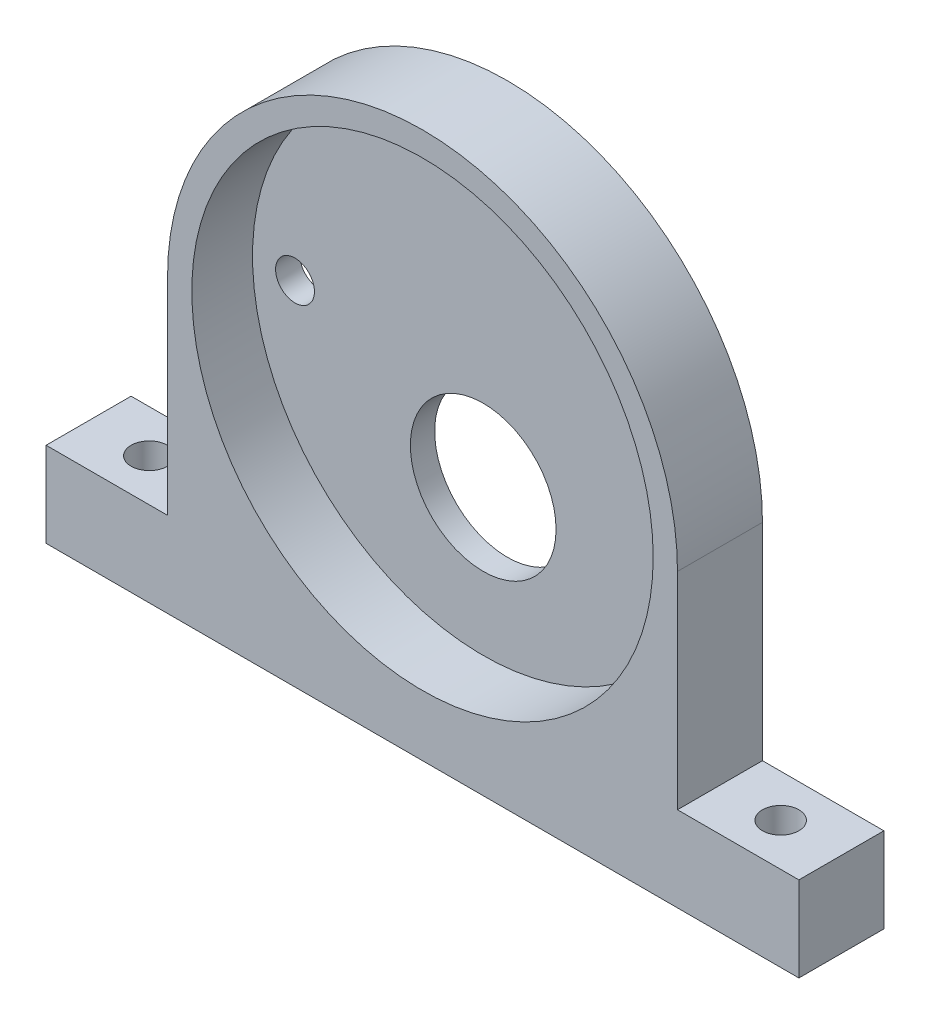
ISO-10303-21;
HEADER;
FILE_DESCRIPTION(('STEP AP214'),'2;1');
FILE_NAME('part.step','',(''),(''),'','','');
FILE_SCHEMA(('AUTOMOTIVE_DESIGN { 1 0 10303 214 1 1 1 1 }'));
ENDSEC;
DATA;
#1=APPLICATION_CONTEXT('core data for automotive mechanical design processes');
#2=APPLICATION_PROTOCOL_DEFINITION('international standard','automotive_design',2000,#1);
#3=PRODUCT_CONTEXT('',#1,'mechanical');
#4=PRODUCT('Part','Part','',(#3));
#5=PRODUCT_RELATED_PRODUCT_CATEGORY('part','',(#4));
#6=PRODUCT_DEFINITION_FORMATION('','',#4);
#7=PRODUCT_DEFINITION_CONTEXT('part definition',#1,'design');
#8=PRODUCT_DEFINITION('design','',#6,#7);
#9=PRODUCT_DEFINITION_SHAPE('','',#8);
#10=(LENGTH_UNIT() NAMED_UNIT(*) SI_UNIT(.MILLI.,.METRE.));
#11=(NAMED_UNIT(*) PLANE_ANGLE_UNIT() SI_UNIT($,.RADIAN.));
#12=(NAMED_UNIT(*) SI_UNIT($,.STERADIAN.) SOLID_ANGLE_UNIT());
#13=UNCERTAINTY_MEASURE_WITH_UNIT(LENGTH_MEASURE(1.E-05),#10,'distance_accuracy_value','');
#14=(GEOMETRIC_REPRESENTATION_CONTEXT(3) GLOBAL_UNCERTAINTY_ASSIGNED_CONTEXT((#13)) GLOBAL_UNIT_ASSIGNED_CONTEXT((#10,
#11,#12)) REPRESENTATION_CONTEXT('',''));
#15=CARTESIAN_POINT('',(0.,0.,0.));
#16=DIRECTION('',(0.,0.,1.));
#17=DIRECTION('',(1.,0.,0.));
#18=AXIS2_PLACEMENT_3D('',#15,#16,#17);
#19=CARTESIAN_POINT('',(0.,3.5,7.));
#20=DIRECTION('',(0.,1.,0.));
#21=DIRECTION('',(0.,0.,1.));
#22=AXIS2_PLACEMENT_3D('',#19,#20,#21);
#23=PLANE('',#22);
#24=CARTESIAN_POINT('',(26.,3.5,3.50000000000008));
#25=DIRECTION('',(0.,1.,0.));
#26=DIRECTION('',(0.,0.,-1.));
#27=AXIS2_PLACEMENT_3D('',#24,#25,#26);
#28=CIRCLE('',#27,1.5);
#29=CARTESIAN_POINT('',(26.,3.5,2.00000000000008));
#30=VERTEX_POINT('',#29);
#31=EDGE_CURVE('E215',#30,#30,#28,.T.);
#32=ORIENTED_EDGE('',*,*,#31,.F.);
#33=EDGE_LOOP('',(#32));
#34=FACE_BOUND('',#33,.T.);
#35=DIRECTION('',(1.,0.,0.));
#36=VECTOR('',#35,1.);
#37=CARTESIAN_POINT('',(0.,3.5,0.));
#38=LINE('',#37,#36);
#39=CARTESIAN_POINT('',(21.,3.5,0.));
#40=VERTEX_POINT('',#39);
#41=CARTESIAN_POINT('',(31.,3.5,0.));
#42=VERTEX_POINT('',#41);
#43=EDGE_CURVE('E145',#40,#42,#38,.T.);
#44=ORIENTED_EDGE('',*,*,#43,.F.);
#45=DIRECTION('',(0.,0.,-1.));
#46=VECTOR('',#45,1.);
#47=CARTESIAN_POINT('',(21.,3.5,7.));
#48=LINE('',#47,#46);
#49=CARTESIAN_POINT('',(21.,3.5,7.));
#50=VERTEX_POINT('',#49);
#51=EDGE_CURVE('E11',#50,#40,#48,.T.);
#52=ORIENTED_EDGE('',*,*,#51,.F.);
#53=DIRECTION('',(1.,0.,0.));
#54=VECTOR('',#53,1.);
#55=CARTESIAN_POINT('',(0.,3.5,7.));
#56=LINE('',#55,#54);
#57=CARTESIAN_POINT('',(31.,3.5,7.));
#58=VERTEX_POINT('',#57);
#59=EDGE_CURVE('E140',#50,#58,#56,.T.);
#60=ORIENTED_EDGE('',*,*,#59,.T.);
#61=DIRECTION('',(0.,0.,-1.));
#62=VECTOR('',#61,1.);
#63=CARTESIAN_POINT('',(31.,3.5,7.));
#64=LINE('',#63,#62);
#65=EDGE_CURVE('E98',#58,#42,#64,.T.);
#66=ORIENTED_EDGE('',*,*,#65,.T.);
#67=EDGE_LOOP('',(#44,#52,#60,#66));
#68=FACE_BOUND('',#67,.T.);
#69=ADVANCED_FACE('F46',(#34,#68),#23,.T.);
#70=CARTESIAN_POINT('',(21.,0.,7.));
#71=DIRECTION('',(1.,0.,0.));
#72=DIRECTION('',(0.,0.,-1.));
#73=AXIS2_PLACEMENT_3D('',#70,#71,#72);
#74=PLANE('',#73);
#75=DIRECTION('',(0.,-1.,0.));
#76=VECTOR('',#75,1.);
#77=CARTESIAN_POINT('',(21.,0.,0.));
#78=LINE('',#77,#76);
#79=CARTESIAN_POINT('',(21.,20.5,0.));
#80=VERTEX_POINT('',#79);
#81=EDGE_CURVE('E148',#80,#40,#78,.T.);
#82=ORIENTED_EDGE('',*,*,#81,.F.);
#83=DIRECTION('',(0.,0.,-1.));
#84=VECTOR('',#83,1.);
#85=CARTESIAN_POINT('',(21.,20.5,7.));
#86=LINE('',#85,#84);
#87=CARTESIAN_POINT('',(21.,20.5,7.));
#88=VERTEX_POINT('',#87);
#89=EDGE_CURVE('E55',#88,#80,#86,.T.);
#90=ORIENTED_EDGE('',*,*,#89,.F.);
#91=DIRECTION('',(0.,-1.,0.));
#92=VECTOR('',#91,1.);
#93=CARTESIAN_POINT('',(21.,0.,7.));
#94=LINE('',#93,#92);
#95=EDGE_CURVE('E183',#88,#50,#94,.T.);
#96=ORIENTED_EDGE('',*,*,#95,.T.);
#97=ORIENTED_EDGE('',*,*,#51,.T.);
#98=EDGE_LOOP('',(#82,#90,#96,#97));
#99=FACE_BOUND('',#98,.T.);
#100=ADVANCED_FACE('F48',(#99),#74,.T.);
#101=CARTESIAN_POINT('',(0.,20.5,7.));
#102=DIRECTION('',(0.,0.,-1.));
#103=DIRECTION('',(-1.,0.,0.));
#104=AXIS2_PLACEMENT_3D('',#101,#102,#103);
#105=CYLINDRICAL_SURFACE('',#104,21.);
#106=CARTESIAN_POINT('',(0.,20.5,0.));
#107=DIRECTION('',(0.,0.,1.));
#108=DIRECTION('',(1.,0.,0.));
#109=AXIS2_PLACEMENT_3D('',#106,#107,#108);
#110=CIRCLE('',#109,21.);
#111=CARTESIAN_POINT('',(-21.,20.5,0.));
#112=VERTEX_POINT('',#111);
#113=EDGE_CURVE('E153',#80,#112,#110,.T.);
#114=ORIENTED_EDGE('',*,*,#113,.T.);
#115=DIRECTION('',(0.,0.,-1.));
#116=VECTOR('',#115,1.);
#117=CARTESIAN_POINT('',(-21.,20.5,7.));
#118=LINE('',#117,#116);
#119=CARTESIAN_POINT('',(-21.,20.5,7.));
#120=VERTEX_POINT('',#119);
#121=EDGE_CURVE('E167',#120,#112,#118,.T.);
#122=ORIENTED_EDGE('',*,*,#121,.F.);
#123=CARTESIAN_POINT('',(0.,20.5,7.));
#124=DIRECTION('',(0.,0.,1.));
#125=DIRECTION('',(1.,0.,0.));
#126=AXIS2_PLACEMENT_3D('',#123,#124,#125);
#127=CIRCLE('',#126,21.);
#128=EDGE_CURVE('E174',#88,#120,#127,.T.);
#129=ORIENTED_EDGE('',*,*,#128,.F.);
#130=ORIENTED_EDGE('',*,*,#89,.T.);
#131=EDGE_LOOP('',(#114,#122,#129,#130));
#132=FACE_BOUND('',#131,.T.);
#133=ADVANCED_FACE('F172',(#132),#105,.T.);
#134=CARTESIAN_POINT('',(-21.,0.,7.));
#135=DIRECTION('',(1.,0.,0.));
#136=DIRECTION('',(0.,0.,-1.));
#137=AXIS2_PLACEMENT_3D('',#134,#135,#136);
#138=PLANE('',#137);
#139=DIRECTION('',(0.,-1.,0.));
#140=VECTOR('',#139,1.);
#141=CARTESIAN_POINT('',(-21.,0.,0.));
#142=LINE('',#141,#140);
#143=CARTESIAN_POINT('',(-21.,3.5,0.));
#144=VERTEX_POINT('',#143);
#145=EDGE_CURVE('E155',#112,#144,#142,.T.);
#146=ORIENTED_EDGE('',*,*,#145,.T.);
#147=DIRECTION('',(0.,0.,-1.));
#148=VECTOR('',#147,1.);
#149=CARTESIAN_POINT('',(-21.,3.5,7.));
#150=LINE('',#149,#148);
#151=CARTESIAN_POINT('',(-21.,3.5,7.));
#152=VERTEX_POINT('',#151);
#153=EDGE_CURVE('E165',#152,#144,#150,.T.);
#154=ORIENTED_EDGE('',*,*,#153,.F.);
#155=DIRECTION('',(0.,-1.,0.));
#156=VECTOR('',#155,1.);
#157=CARTESIAN_POINT('',(-21.,0.,7.));
#158=LINE('',#157,#156);
#159=EDGE_CURVE('E138',#120,#152,#158,.T.);
#160=ORIENTED_EDGE('',*,*,#159,.F.);
#161=ORIENTED_EDGE('',*,*,#121,.T.);
#162=EDGE_LOOP('',(#146,#154,#160,#161));
#163=FACE_BOUND('',#162,.T.);
#164=ADVANCED_FACE('F194',(#163),#138,.F.);
#165=CARTESIAN_POINT('',(-26.,3.5,3.5));
#166=DIRECTION('',(0.,1.,0.));
#167=DIRECTION('',(0.,0.,1.));
#168=AXIS2_PLACEMENT_3D('',#165,#166,#167);
#169=CIRCLE('',#168,1.5);
#170=CARTESIAN_POINT('',(-26.,3.5,5.));
#171=VERTEX_POINT('',#170);
#172=EDGE_CURVE('E217',#171,#171,#169,.T.);
#173=ORIENTED_EDGE('',*,*,#172,.F.);
#174=EDGE_LOOP('',(#173));
#175=FACE_BOUND('',#174,.T.);
#176=CARTESIAN_POINT('',(-31.,3.5,0.));
#177=VERTEX_POINT('',#176);
#178=EDGE_CURVE('E150',#177,#144,#38,.T.);
#179=ORIENTED_EDGE('',*,*,#178,.F.);
#180=DIRECTION('',(0.,0.,-1.));
#181=VECTOR('',#180,1.);
#182=CARTESIAN_POINT('',(-31.,3.5,7.));
#183=LINE('',#182,#181);
#184=CARTESIAN_POINT('',(-31.,3.5,7.));
#185=VERTEX_POINT('',#184);
#186=EDGE_CURVE('E127',#185,#177,#183,.T.);
#187=ORIENTED_EDGE('',*,*,#186,.F.);
#188=EDGE_CURVE('E136',#185,#152,#56,.T.);
#189=ORIENTED_EDGE('',*,*,#188,.T.);
#190=ORIENTED_EDGE('',*,*,#153,.T.);
#191=EDGE_LOOP('',(#179,#187,#189,#190));
#192=FACE_BOUND('',#191,.T.);
#193=ADVANCED_FACE('F197',(#175,#192),#23,.T.);
#194=CARTESIAN_POINT('',(-31.,0.,7.));
#195=DIRECTION('',(-1.,0.,0.));
#196=DIRECTION('',(0.,0.,1.));
#197=AXIS2_PLACEMENT_3D('',#194,#195,#196);
#198=PLANE('',#197);
#199=DIRECTION('',(0.,1.,0.));
#200=VECTOR('',#199,1.);
#201=CARTESIAN_POINT('',(-31.,0.,0.));
#202=LINE('',#201,#200);
#203=CARTESIAN_POINT('',(-31.,-3.5,0.));
#204=VERTEX_POINT('',#203);
#205=EDGE_CURVE('E126',#204,#177,#202,.T.);
#206=ORIENTED_EDGE('',*,*,#205,.F.);
#207=DIRECTION('',(0.,0.,-1.));
#208=VECTOR('',#207,1.);
#209=CARTESIAN_POINT('',(-31.,-3.5,7.));
#210=LINE('',#209,#208);
#211=CARTESIAN_POINT('',(-31.,-3.5,7.));
#212=VERTEX_POINT('',#211);
#213=EDGE_CURVE('E120',#212,#204,#210,.T.);
#214=ORIENTED_EDGE('',*,*,#213,.F.);
#215=DIRECTION('',(0.,1.,0.));
#216=VECTOR('',#215,1.);
#217=CARTESIAN_POINT('',(-31.,0.,7.));
#218=LINE('',#217,#216);
#219=EDGE_CURVE('E124',#212,#185,#218,.T.);
#220=ORIENTED_EDGE('',*,*,#219,.T.);
#221=ORIENTED_EDGE('',*,*,#186,.T.);
#222=EDGE_LOOP('',(#206,#214,#220,#221));
#223=FACE_BOUND('',#222,.T.);
#224=ADVANCED_FACE('F122',(#223),#198,.T.);
#225=CARTESIAN_POINT('',(0.,-3.5,7.));
#226=DIRECTION('',(0.,1.,0.));
#227=DIRECTION('',(0.,0.,1.));
#228=AXIS2_PLACEMENT_3D('',#225,#226,#227);
#229=PLANE('',#228);
#230=CARTESIAN_POINT('',(-26.,-3.5,3.5));
#231=DIRECTION('',(0.,1.,0.));
#232=DIRECTION('',(0.,0.,1.));
#233=AXIS2_PLACEMENT_3D('',#230,#231,#232);
#234=CIRCLE('',#233,1.5);
#235=CARTESIAN_POINT('',(-26.,-3.5,5.));
#236=VERTEX_POINT('',#235);
#237=EDGE_CURVE('E221',#236,#236,#234,.F.);
#238=ORIENTED_EDGE('',*,*,#237,.F.);
#239=EDGE_LOOP('',(#238));
#240=FACE_BOUND('',#239,.T.);
#241=CARTESIAN_POINT('',(26.,-3.5,3.50000000000008));
#242=DIRECTION('',(0.,1.,0.));
#243=DIRECTION('',(0.,0.,1.));
#244=AXIS2_PLACEMENT_3D('',#241,#242,#243);
#245=CIRCLE('',#244,1.5);
#246=CARTESIAN_POINT('',(26.,-3.5,5.00000000000007));
#247=VERTEX_POINT('',#246);
#248=EDGE_CURVE('E218',#247,#247,#245,.F.);
#249=ORIENTED_EDGE('',*,*,#248,.F.);
#250=EDGE_LOOP('',(#249));
#251=FACE_BOUND('',#250,.T.);
#252=CARTESIAN_POINT('',(-14.,-3.5,3.49999999999996));
#253=DIRECTION('',(0.,-1.,0.));
#254=DIRECTION('',(0.,0.,-1.));
#255=AXIS2_PLACEMENT_3D('',#252,#253,#254);
#256=CIRCLE('',#255,1.25);
#257=CARTESIAN_POINT('',(-14.,-3.5,2.24999999999996));
#258=VERTEX_POINT('',#257);
#259=EDGE_CURVE('E227',#258,#258,#256,.T.);
#260=ORIENTED_EDGE('',*,*,#259,.F.);
#261=EDGE_LOOP('',(#260));
#262=FACE_BOUND('',#261,.T.);
#263=CARTESIAN_POINT('',(14.,-3.5,3.5));
#264=DIRECTION('',(0.,-1.,0.));
#265=DIRECTION('',(0.,0.,-1.));
#266=AXIS2_PLACEMENT_3D('',#263,#264,#265);
#267=CIRCLE('',#266,1.25);
#268=CARTESIAN_POINT('',(14.,-3.5,2.25));
#269=VERTEX_POINT('',#268);
#270=EDGE_CURVE('E233',#269,#269,#267,.T.);
#271=ORIENTED_EDGE('',*,*,#270,.F.);
#272=EDGE_LOOP('',(#271));
#273=FACE_BOUND('',#272,.T.);
#274=DIRECTION('',(1.,0.,0.));
#275=VECTOR('',#274,1.);
#276=CARTESIAN_POINT('',(0.,-3.5,0.));
#277=LINE('',#276,#275);
#278=CARTESIAN_POINT('',(31.,-3.5,0.));
#279=VERTEX_POINT('',#278);
#280=EDGE_CURVE('E91',#204,#279,#277,.T.);
#281=ORIENTED_EDGE('',*,*,#280,.T.);
#282=DIRECTION('',(0.,0.,-1.));
#283=VECTOR('',#282,1.);
#284=CARTESIAN_POINT('',(31.,-3.5,7.));
#285=LINE('',#284,#283);
#286=CARTESIAN_POINT('',(31.,-3.5,7.));
#287=VERTEX_POINT('',#286);
#288=EDGE_CURVE('E128',#287,#279,#285,.T.);
#289=ORIENTED_EDGE('',*,*,#288,.F.);
#290=DIRECTION('',(1.,0.,0.));
#291=VECTOR('',#290,1.);
#292=CARTESIAN_POINT('',(0.,-3.5,7.));
#293=LINE('',#292,#291);
#294=EDGE_CURVE('E130',#212,#287,#293,.T.);
#295=ORIENTED_EDGE('',*,*,#294,.F.);
#296=ORIENTED_EDGE('',*,*,#213,.T.);
#297=EDGE_LOOP('',(#281,#289,#295,#296));
#298=FACE_BOUND('',#297,.T.);
#299=ADVANCED_FACE('F131',(#240,#251,#262,#273,#298),#229,.F.);
#300=CARTESIAN_POINT('',(31.,0.,7.));
#301=DIRECTION('',(-1.,0.,0.));
#302=DIRECTION('',(0.,-1.,0.));
#303=AXIS2_PLACEMENT_3D('',#300,#301,#302);
#304=PLANE('',#303);
#305=DIRECTION('',(0.,1.,0.));
#306=VECTOR('',#305,1.);
#307=CARTESIAN_POINT('',(31.,0.,0.));
#308=LINE('',#307,#306);
#309=EDGE_CURVE('E160',#279,#42,#308,.T.);
#310=ORIENTED_EDGE('',*,*,#309,.T.);
#311=ORIENTED_EDGE('',*,*,#65,.F.);
#312=DIRECTION('',(0.,1.,0.));
#313=VECTOR('',#312,1.);
#314=CARTESIAN_POINT('',(31.,0.,7.));
#315=LINE('',#314,#313);
#316=EDGE_CURVE('E63',#287,#58,#315,.T.);
#317=ORIENTED_EDGE('',*,*,#316,.F.);
#318=ORIENTED_EDGE('',*,*,#288,.T.);
#319=EDGE_LOOP('',(#310,#311,#317,#318));
#320=FACE_BOUND('',#319,.T.);
#321=ADVANCED_FACE('F186',(#320),#304,.F.);
#322=CARTESIAN_POINT('',(0.,0.,7.));
#323=DIRECTION('',(0.,0.,1.));
#324=DIRECTION('',(1.,0.,0.));
#325=AXIS2_PLACEMENT_3D('',#322,#323,#324);
#326=PLANE('',#325);
#327=CARTESIAN_POINT('',(0.,20.5,7.));
#328=DIRECTION('',(0.,0.,1.));
#329=DIRECTION('',(1.,0.,0.));
#330=AXIS2_PLACEMENT_3D('',#327,#328,#329);
#331=CIRCLE('',#330,19.);
#332=CARTESIAN_POINT('',(19.,20.5,7.));
#333=VERTEX_POINT('',#332);
#334=EDGE_CURVE('E189',#333,#333,#331,.T.);
#335=ORIENTED_EDGE('',*,*,#334,.F.);
#336=EDGE_LOOP('',(#335));
#337=FACE_BOUND('',#336,.T.);
#338=ORIENTED_EDGE('',*,*,#59,.F.);
#339=ORIENTED_EDGE('',*,*,#95,.F.);
#340=ORIENTED_EDGE('',*,*,#128,.T.);
#341=ORIENTED_EDGE('',*,*,#159,.T.);
#342=ORIENTED_EDGE('',*,*,#188,.F.);
#343=ORIENTED_EDGE('',*,*,#219,.F.);
#344=ORIENTED_EDGE('',*,*,#294,.T.);
#345=ORIENTED_EDGE('',*,*,#316,.T.);
#346=EDGE_LOOP('',(#338,#339,#340,#341,#342,#343,#344,#345));
#347=FACE_BOUND('',#346,.T.);
#348=ADVANCED_FACE('F134',(#337,#347),#326,.T.);
#349=CARTESIAN_POINT('',(0.,0.,0.));
#350=DIRECTION('',(0.,0.,1.));
#351=DIRECTION('',(1.,0.,0.));
#352=AXIS2_PLACEMENT_3D('',#349,#350,#351);
#353=PLANE('',#352);
#354=CARTESIAN_POINT('',(-15.5,20.5,0.));
#355=DIRECTION('',(0.,0.,1.));
#356=DIRECTION('',(1.,0.,0.));
#357=AXIS2_PLACEMENT_3D('',#354,#355,#356);
#358=CIRCLE('',#357,1.6);
#359=CARTESIAN_POINT('',(-13.9,20.5,0.));
#360=VERTEX_POINT('',#359);
#361=EDGE_CURVE('E254',#360,#360,#358,.T.);
#362=ORIENTED_EDGE('',*,*,#361,.T.);
#363=EDGE_LOOP('',(#362));
#364=FACE_BOUND('',#363,.T.);
#365=CARTESIAN_POINT('',(15.5,20.5,0.));
#366=DIRECTION('',(0.,0.,1.));
#367=DIRECTION('',(1.,0.,0.));
#368=AXIS2_PLACEMENT_3D('',#365,#366,#367);
#369=CIRCLE('',#368,1.6);
#370=CARTESIAN_POINT('',(17.1,20.5,0.));
#371=VERTEX_POINT('',#370);
#372=EDGE_CURVE('E251',#371,#371,#369,.T.);
#373=ORIENTED_EDGE('',*,*,#372,.T.);
#374=EDGE_LOOP('',(#373));
#375=FACE_BOUND('',#374,.T.);
#376=CARTESIAN_POINT('',(0.,13.5,0.));
#377=DIRECTION('',(0.,0.,1.));
#378=DIRECTION('',(1.,0.,0.));
#379=AXIS2_PLACEMENT_3D('',#376,#377,#378);
#380=CIRCLE('',#379,6.);
#381=CARTESIAN_POINT('',(6.,13.5,0.));
#382=VERTEX_POINT('',#381);
#383=EDGE_CURVE('E248',#382,#382,#380,.T.);
#384=ORIENTED_EDGE('',*,*,#383,.T.);
#385=EDGE_LOOP('',(#384));
#386=FACE_BOUND('',#385,.T.);
#387=ORIENTED_EDGE('',*,*,#43,.T.);
#388=ORIENTED_EDGE('',*,*,#309,.F.);
#389=ORIENTED_EDGE('',*,*,#280,.F.);
#390=ORIENTED_EDGE('',*,*,#205,.T.);
#391=ORIENTED_EDGE('',*,*,#178,.T.);
#392=ORIENTED_EDGE('',*,*,#145,.F.);
#393=ORIENTED_EDGE('',*,*,#113,.F.);
#394=ORIENTED_EDGE('',*,*,#81,.T.);
#395=EDGE_LOOP('',(#387,#388,#389,#390,#391,#392,#393,#394));
#396=FACE_BOUND('',#395,.T.);
#397=ADVANCED_FACE('F181',(#364,#375,#386,#396),#353,.F.);
#398=CARTESIAN_POINT('',(0.,20.5,2.));
#399=DIRECTION('',(0.,0.,1.));
#400=DIRECTION('',(1.,0.,0.));
#401=AXIS2_PLACEMENT_3D('',#398,#399,#400);
#402=CYLINDRICAL_SURFACE('',#401,19.);
#403=CARTESIAN_POINT('',(0.,20.5,2.));
#404=DIRECTION('',(0.,0.,1.));
#405=DIRECTION('',(1.,0.,0.));
#406=AXIS2_PLACEMENT_3D('',#403,#404,#405);
#407=CIRCLE('',#406,19.);
#408=CARTESIAN_POINT('',(19.,20.5,2.));
#409=VERTEX_POINT('',#408);
#410=EDGE_CURVE('E149',#409,#409,#407,.T.);
#411=ORIENTED_EDGE('',*,*,#410,.F.);
#412=EDGE_LOOP('',(#411));
#413=FACE_BOUND('',#412,.T.);
#414=ORIENTED_EDGE('',*,*,#334,.T.);
#415=EDGE_LOOP('',(#414));
#416=FACE_BOUND('',#415,.T.);
#417=ADVANCED_FACE('F262',(#413,#416),#402,.F.);
#418=CARTESIAN_POINT('',(0.,20.5,2.));
#419=DIRECTION('',(0.,0.,1.));
#420=DIRECTION('',(1.,0.,0.));
#421=AXIS2_PLACEMENT_3D('',#418,#419,#420);
#422=PLANE('',#421);
#423=CARTESIAN_POINT('',(-15.5,20.5,2.));
#424=DIRECTION('',(0.,0.,1.));
#425=DIRECTION('',(-1.,0.,0.));
#426=AXIS2_PLACEMENT_3D('',#423,#424,#425);
#427=CIRCLE('',#426,1.6);
#428=CARTESIAN_POINT('',(-17.1,20.5,2.));
#429=VERTEX_POINT('',#428);
#430=EDGE_CURVE('E239',#429,#429,#427,.T.);
#431=ORIENTED_EDGE('',*,*,#430,.F.);
#432=EDGE_LOOP('',(#431));
#433=FACE_BOUND('',#432,.T.);
#434=CARTESIAN_POINT('',(15.5,20.5,2.));
#435=DIRECTION('',(0.,0.,1.));
#436=DIRECTION('',(1.,0.,0.));
#437=AXIS2_PLACEMENT_3D('',#434,#435,#436);
#438=CIRCLE('',#437,1.6);
#439=CARTESIAN_POINT('',(17.1,20.5,2.));
#440=VERTEX_POINT('',#439);
#441=EDGE_CURVE('E240',#440,#440,#438,.T.);
#442=ORIENTED_EDGE('',*,*,#441,.F.);
#443=EDGE_LOOP('',(#442));
#444=FACE_BOUND('',#443,.T.);
#445=CARTESIAN_POINT('',(0.,13.5,2.));
#446=DIRECTION('',(0.,0.,1.));
#447=DIRECTION('',(1.,0.,0.));
#448=AXIS2_PLACEMENT_3D('',#445,#446,#447);
#449=CIRCLE('',#448,6.);
#450=CARTESIAN_POINT('',(6.,13.5,2.));
#451=VERTEX_POINT('',#450);
#452=EDGE_CURVE('E243',#451,#451,#449,.T.);
#453=ORIENTED_EDGE('',*,*,#452,.F.);
#454=EDGE_LOOP('',(#453));
#455=FACE_BOUND('',#454,.T.);
#456=ORIENTED_EDGE('',*,*,#410,.T.);
#457=EDGE_LOOP('',(#456));
#458=FACE_BOUND('',#457,.T.);
#459=ADVANCED_FACE('F317',(#433,#444,#455,#458),#422,.T.);
#460=CARTESIAN_POINT('',(0.,13.5,-3.));
#461=DIRECTION('',(0.,0.,1.));
#462=DIRECTION('',(1.,0.,0.));
#463=AXIS2_PLACEMENT_3D('',#460,#461,#462);
#464=CYLINDRICAL_SURFACE('',#463,6.);
#465=ORIENTED_EDGE('',*,*,#452,.T.);
#466=EDGE_LOOP('',(#465));
#467=FACE_BOUND('',#466,.T.);
#468=ORIENTED_EDGE('',*,*,#383,.F.);
#469=EDGE_LOOP('',(#468));
#470=FACE_BOUND('',#469,.T.);
#471=ADVANCED_FACE('F311',(#467,#470),#464,.F.);
#472=CARTESIAN_POINT('',(15.5,20.5,-3.));
#473=DIRECTION('',(0.,0.,1.));
#474=DIRECTION('',(1.,0.,0.));
#475=AXIS2_PLACEMENT_3D('',#472,#473,#474);
#476=CYLINDRICAL_SURFACE('',#475,1.6);
#477=ORIENTED_EDGE('',*,*,#441,.T.);
#478=EDGE_LOOP('',(#477));
#479=FACE_BOUND('',#478,.T.);
#480=ORIENTED_EDGE('',*,*,#372,.F.);
#481=EDGE_LOOP('',(#480));
#482=FACE_BOUND('',#481,.T.);
#483=ADVANCED_FACE('F308',(#479,#482),#476,.F.);
#484=CARTESIAN_POINT('',(-15.5,20.5,-3.));
#485=DIRECTION('',(0.,0.,1.));
#486=DIRECTION('',(1.,0.,0.));
#487=AXIS2_PLACEMENT_3D('',#484,#485,#486);
#488=CYLINDRICAL_SURFACE('',#487,1.6);
#489=ORIENTED_EDGE('',*,*,#430,.T.);
#490=EDGE_LOOP('',(#489));
#491=FACE_BOUND('',#490,.T.);
#492=ORIENTED_EDGE('',*,*,#361,.F.);
#493=EDGE_LOOP('',(#492));
#494=FACE_BOUND('',#493,.T.);
#495=ADVANCED_FACE('F302',(#491,#494),#488,.F.);
#496=CARTESIAN_POINT('',(14.,1.5,3.5));
#497=DIRECTION('',(0.,-1.,0.));
#498=DIRECTION('',(0.,0.,-1.));
#499=AXIS2_PLACEMENT_3D('',#496,#497,#498);
#500=CONICAL_SURFACE('',#499,1.25,1.02974425867665);
#501=CARTESIAN_POINT('',(14.,2.25107577378445,3.5));
#502=VERTEX_POINT('',#501);
#503=VERTEX_LOOP('',#502);
#504=FACE_BOUND('',#503,.T.);
#505=CARTESIAN_POINT('',(14.,1.5,3.5));
#506=DIRECTION('',(0.,-1.,0.));
#507=DIRECTION('',(0.,0.,-1.));
#508=AXIS2_PLACEMENT_3D('',#505,#506,#507);
#509=CIRCLE('',#508,1.25);
#510=CARTESIAN_POINT('',(14.,1.5,2.25));
#511=VERTEX_POINT('',#510);
#512=EDGE_CURVE('E236',#511,#511,#509,.T.);
#513=ORIENTED_EDGE('',*,*,#512,.T.);
#514=EDGE_LOOP('',(#513));
#515=FACE_BOUND('',#514,.T.);
#516=ADVANCED_FACE('F292',(#504,#515),#500,.F.);
#517=CARTESIAN_POINT('',(14.,-3.5,3.5));
#518=DIRECTION('',(0.,-1.,0.));
#519=DIRECTION('',(0.,0.,-1.));
#520=AXIS2_PLACEMENT_3D('',#517,#518,#519);
#521=CYLINDRICAL_SURFACE('',#520,1.25);
#522=ORIENTED_EDGE('',*,*,#512,.F.);
#523=EDGE_LOOP('',(#522));
#524=FACE_BOUND('',#523,.T.);
#525=ORIENTED_EDGE('',*,*,#270,.T.);
#526=EDGE_LOOP('',(#525));
#527=FACE_BOUND('',#526,.T.);
#528=ADVANCED_FACE('F289',(#524,#527),#521,.F.);
#529=CARTESIAN_POINT('',(-14.,1.5,3.49999999999996));
#530=DIRECTION('',(0.,-1.,0.));
#531=DIRECTION('',(0.,0.,-1.));
#532=AXIS2_PLACEMENT_3D('',#529,#530,#531);
#533=CONICAL_SURFACE('',#532,1.25,1.02974425867665);
#534=CARTESIAN_POINT('',(-14.,2.25107577378445,3.49999999999996));
#535=VERTEX_POINT('',#534);
#536=VERTEX_LOOP('',#535);
#537=FACE_BOUND('',#536,.T.);
#538=CARTESIAN_POINT('',(-14.,1.5,3.49999999999996));
#539=DIRECTION('',(0.,-1.,0.));
#540=DIRECTION('',(0.,0.,-1.));
#541=AXIS2_PLACEMENT_3D('',#538,#539,#540);
#542=CIRCLE('',#541,1.25);
#543=CARTESIAN_POINT('',(-14.,1.5,2.24999999999996));
#544=VERTEX_POINT('',#543);
#545=EDGE_CURVE('E230',#544,#544,#542,.T.);
#546=ORIENTED_EDGE('',*,*,#545,.T.);
#547=EDGE_LOOP('',(#546));
#548=FACE_BOUND('',#547,.T.);
#549=ADVANCED_FACE('F291',(#537,#548),#533,.F.);
#550=CARTESIAN_POINT('',(-14.,-3.5,3.49999999999996));
#551=DIRECTION('',(0.,-1.,0.));
#552=DIRECTION('',(0.,0.,-1.));
#553=AXIS2_PLACEMENT_3D('',#550,#551,#552);
#554=CYLINDRICAL_SURFACE('',#553,1.25);
#555=ORIENTED_EDGE('',*,*,#545,.F.);
#556=EDGE_LOOP('',(#555));
#557=FACE_BOUND('',#556,.T.);
#558=ORIENTED_EDGE('',*,*,#259,.T.);
#559=EDGE_LOOP('',(#558));
#560=FACE_BOUND('',#559,.T.);
#561=ADVANCED_FACE('F299',(#557,#560),#554,.F.);
#562=CARTESIAN_POINT('',(26.,-7.74264068711929,3.50000000000008));
#563=DIRECTION('',(0.,1.,0.));
#564=DIRECTION('',(0.,0.,1.));
#565=AXIS2_PLACEMENT_3D('',#562,#563,#564);
#566=CYLINDRICAL_SURFACE('',#565,1.5);
#567=ORIENTED_EDGE('',*,*,#248,.T.);
#568=EDGE_LOOP('',(#567));
#569=FACE_BOUND('',#568,.T.);
#570=ORIENTED_EDGE('',*,*,#31,.T.);
#571=EDGE_LOOP('',(#570));
#572=FACE_BOUND('',#571,.T.);
#573=ADVANCED_FACE('F403',(#569,#572),#566,.F.);
#574=CARTESIAN_POINT('',(-26.,-7.74264068711929,3.5));
#575=DIRECTION('',(0.,1.,0.));
#576=DIRECTION('',(0.,0.,1.));
#577=AXIS2_PLACEMENT_3D('',#574,#575,#576);
#578=CYLINDRICAL_SURFACE('',#577,1.5);
#579=ORIENTED_EDGE('',*,*,#237,.T.);
#580=EDGE_LOOP('',(#579));
#581=FACE_BOUND('',#580,.T.);
#582=ORIENTED_EDGE('',*,*,#172,.T.);
#583=EDGE_LOOP('',(#582));
#584=FACE_BOUND('',#583,.T.);
#585=ADVANCED_FACE('F433',(#581,#584),#578,.F.);
#586=CLOSED_SHELL('',(#69,#100,#133,#164,#193,#224,#299,#321,#348,#397,#417,#459,#471,#483,#495,
#516,#528,#549,#561,#573,#585));
#587=MANIFOLD_SOLID_BREP('B2',#586);
#588=ADVANCED_BREP_SHAPE_REPRESENTATION('',(#18,#587),#14);
#589=SHAPE_DEFINITION_REPRESENTATION(#9,#588);
ENDSEC;
END-ISO-10303-21;
